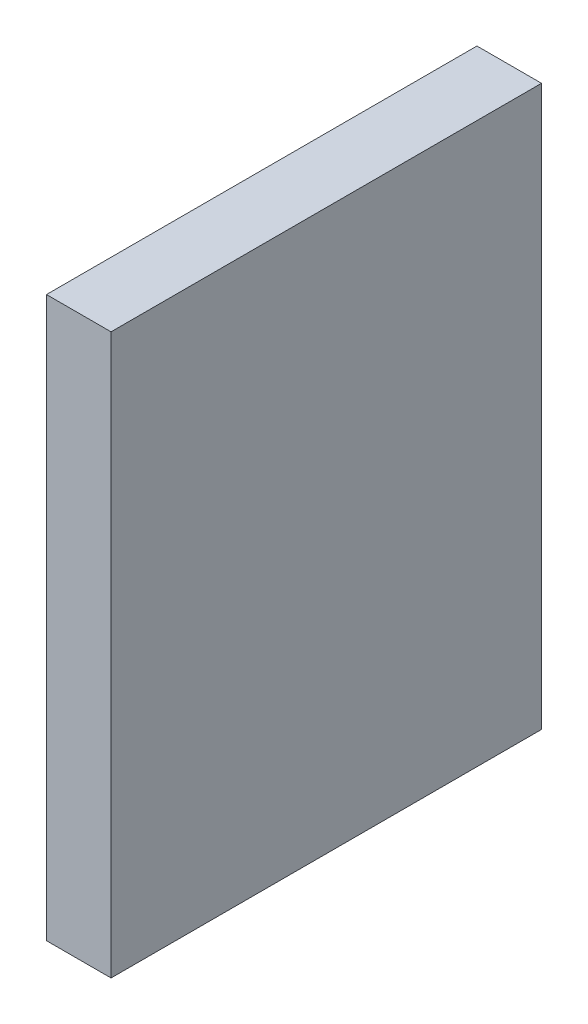
ISO-10303-21;
HEADER;
FILE_DESCRIPTION(('STEP AP214'),'2;1');
FILE_NAME('part.step','',(''),(''),'','','');
FILE_SCHEMA(('AUTOMOTIVE_DESIGN { 1 0 10303 214 1 1 1 1 }'));
ENDSEC;
DATA;
#1=APPLICATION_CONTEXT('core data for automotive mechanical design processes');
#2=APPLICATION_PROTOCOL_DEFINITION('international standard','automotive_design',2000,#1);
#3=PRODUCT_CONTEXT('',#1,'mechanical');
#4=PRODUCT('Part','Part','',(#3));
#5=PRODUCT_RELATED_PRODUCT_CATEGORY('part','',(#4));
#6=PRODUCT_DEFINITION_FORMATION('','',#4);
#7=PRODUCT_DEFINITION_CONTEXT('part definition',#1,'design');
#8=PRODUCT_DEFINITION('design','',#6,#7);
#9=PRODUCT_DEFINITION_SHAPE('','',#8);
#10=(LENGTH_UNIT() NAMED_UNIT(*) SI_UNIT(.MILLI.,.METRE.));
#11=(NAMED_UNIT(*) PLANE_ANGLE_UNIT() SI_UNIT($,.RADIAN.));
#12=(NAMED_UNIT(*) SI_UNIT($,.STERADIAN.) SOLID_ANGLE_UNIT());
#13=UNCERTAINTY_MEASURE_WITH_UNIT(LENGTH_MEASURE(1.E-05),#10,'distance_accuracy_value','');
#14=(GEOMETRIC_REPRESENTATION_CONTEXT(3) GLOBAL_UNCERTAINTY_ASSIGNED_CONTEXT((#13)) GLOBAL_UNIT_ASSIGNED_CONTEXT((#10,
#11,#12)) REPRESENTATION_CONTEXT('',''));
#15=CARTESIAN_POINT('',(0.,0.,0.));
#16=DIRECTION('',(0.,0.,1.));
#17=DIRECTION('',(1.,0.,0.));
#18=AXIS2_PLACEMENT_3D('',#15,#16,#17);
#19=CARTESIAN_POINT('',(-54.4573355862781,130.,-87.1653156513389));
#20=DIRECTION('',(1.,0.,0.));
#21=DIRECTION('',(0.,0.,-1.));
#22=AXIS2_PLACEMENT_3D('',#19,#20,#21);
#23=PLANE('',#22);
#24=DIRECTION('',(0.,0.,1.));
#25=VECTOR('',#24,1.);
#26=CARTESIAN_POINT('',(-54.4573355862781,0.,-87.1653156513389));
#27=LINE('',#26,#25);
#28=CARTESIAN_POINT('',(-54.4573355862781,0.,-87.1653156513389));
#29=VERTEX_POINT('',#28);
#30=CARTESIAN_POINT('',(-54.4573355862781,0.,12.8346843486611));
#31=VERTEX_POINT('',#30);
#32=EDGE_CURVE('E96',#29,#31,#27,.T.);
#33=ORIENTED_EDGE('',*,*,#32,.T.);
#34=DIRECTION('',(0.,-1.,0.));
#35=VECTOR('',#34,1.);
#36=CARTESIAN_POINT('',(-54.4573355862781,130.,12.8346843486611));
#37=LINE('',#36,#35);
#38=CARTESIAN_POINT('',(-54.4573355862781,130.,12.8346843486611));
#39=VERTEX_POINT('',#38);
#40=EDGE_CURVE('E11',#39,#31,#37,.T.);
#41=ORIENTED_EDGE('',*,*,#40,.F.);
#42=DIRECTION('',(0.,0.,1.));
#43=VECTOR('',#42,1.);
#44=CARTESIAN_POINT('',(-54.4573355862781,130.,-87.1653156513389));
#45=LINE('',#44,#43);
#46=CARTESIAN_POINT('',(-54.4573355862781,130.,-87.1653156513389));
#47=VERTEX_POINT('',#46);
#48=EDGE_CURVE('E84',#47,#39,#45,.T.);
#49=ORIENTED_EDGE('',*,*,#48,.F.);
#50=DIRECTION('',(0.,-1.,0.));
#51=VECTOR('',#50,1.);
#52=CARTESIAN_POINT('',(-54.4573355862781,130.,-87.1653156513389));
#53=LINE('',#52,#51);
#54=EDGE_CURVE('E92',#47,#29,#53,.T.);
#55=ORIENTED_EDGE('',*,*,#54,.T.);
#56=EDGE_LOOP('',(#33,#41,#49,#55));
#57=FACE_BOUND('',#56,.T.);
#58=ADVANCED_FACE('F33',(#57),#23,.F.);
#59=CARTESIAN_POINT('',(-54.4573355862781,130.,12.8346843486611));
#60=DIRECTION('',(0.,0.,-1.));
#61=DIRECTION('',(-1.,0.,0.));
#62=AXIS2_PLACEMENT_3D('',#59,#60,#61);
#63=PLANE('',#62);
#64=DIRECTION('',(1.,0.,0.));
#65=VECTOR('',#64,1.);
#66=CARTESIAN_POINT('',(-54.4573355862781,0.,12.8346843486611));
#67=LINE('',#66,#65);
#68=CARTESIAN_POINT('',(-39.4573355862781,0.,12.8346843486611));
#69=VERTEX_POINT('',#68);
#70=EDGE_CURVE('E88',#31,#69,#67,.T.);
#71=ORIENTED_EDGE('',*,*,#70,.T.);
#72=DIRECTION('',(0.,-1.,0.));
#73=VECTOR('',#72,1.);
#74=CARTESIAN_POINT('',(-39.4573355862781,130.,12.8346843486611));
#75=LINE('',#74,#73);
#76=CARTESIAN_POINT('',(-39.4573355862781,130.,12.8346843486611));
#77=VERTEX_POINT('',#76);
#78=EDGE_CURVE('E41',#77,#69,#75,.T.);
#79=ORIENTED_EDGE('',*,*,#78,.F.);
#80=DIRECTION('',(1.,0.,0.));
#81=VECTOR('',#80,1.);
#82=CARTESIAN_POINT('',(-54.4573355862781,130.,12.8346843486611));
#83=LINE('',#82,#81);
#84=EDGE_CURVE('E79',#39,#77,#83,.T.);
#85=ORIENTED_EDGE('',*,*,#84,.F.);
#86=ORIENTED_EDGE('',*,*,#40,.T.);
#87=EDGE_LOOP('',(#71,#79,#85,#86));
#88=FACE_BOUND('',#87,.T.);
#89=ADVANCED_FACE('F87',(#88),#63,.F.);
#90=CARTESIAN_POINT('',(-39.4573355862781,130.,-87.1653156513389));
#91=DIRECTION('',(-1.,0.,0.));
#92=DIRECTION('',(0.,0.,1.));
#93=AXIS2_PLACEMENT_3D('',#90,#91,#92);
#94=PLANE('',#93);
#95=DIRECTION('',(0.,0.,-1.));
#96=VECTOR('',#95,1.);
#97=CARTESIAN_POINT('',(-39.4573355862781,0.,-87.1653156513389));
#98=LINE('',#97,#96);
#99=CARTESIAN_POINT('',(-39.4573355862781,0.,-87.1653156513389));
#100=VERTEX_POINT('',#99);
#101=EDGE_CURVE('E66',#69,#100,#98,.T.);
#102=ORIENTED_EDGE('',*,*,#101,.T.);
#103=DIRECTION('',(0.,-1.,0.));
#104=VECTOR('',#103,1.);
#105=CARTESIAN_POINT('',(-39.4573355862781,130.,-87.1653156513389));
#106=LINE('',#105,#104);
#107=CARTESIAN_POINT('',(-39.4573355862781,130.,-87.1653156513389));
#108=VERTEX_POINT('',#107);
#109=EDGE_CURVE('E89',#108,#100,#106,.T.);
#110=ORIENTED_EDGE('',*,*,#109,.F.);
#111=DIRECTION('',(0.,0.,-1.));
#112=VECTOR('',#111,1.);
#113=CARTESIAN_POINT('',(-39.4573355862781,130.,-87.1653156513389));
#114=LINE('',#113,#112);
#115=EDGE_CURVE('E82',#77,#108,#114,.T.);
#116=ORIENTED_EDGE('',*,*,#115,.F.);
#117=ORIENTED_EDGE('',*,*,#78,.T.);
#118=EDGE_LOOP('',(#102,#110,#116,#117));
#119=FACE_BOUND('',#118,.T.);
#120=ADVANCED_FACE('F90',(#119),#94,.F.);
#121=CARTESIAN_POINT('',(-54.4573355862781,130.,-87.1653156513389));
#122=DIRECTION('',(0.,0.,1.));
#123=DIRECTION('',(1.,0.,0.));
#124=AXIS2_PLACEMENT_3D('',#121,#122,#123);
#125=PLANE('',#124);
#126=DIRECTION('',(-1.,0.,0.));
#127=VECTOR('',#126,1.);
#128=CARTESIAN_POINT('',(-54.4573355862781,0.,-87.1653156513389));
#129=LINE('',#128,#127);
#130=EDGE_CURVE('E72',#100,#29,#129,.T.);
#131=ORIENTED_EDGE('',*,*,#130,.T.);
#132=ORIENTED_EDGE('',*,*,#54,.F.);
#133=DIRECTION('',(-1.,0.,0.));
#134=VECTOR('',#133,1.);
#135=CARTESIAN_POINT('',(-54.4573355862781,130.,-87.1653156513389));
#136=LINE('',#135,#134);
#137=EDGE_CURVE('E49',#108,#47,#136,.T.);
#138=ORIENTED_EDGE('',*,*,#137,.F.);
#139=ORIENTED_EDGE('',*,*,#109,.T.);
#140=EDGE_LOOP('',(#131,#132,#138,#139));
#141=FACE_BOUND('',#140,.T.);
#142=ADVANCED_FACE('F103',(#141),#125,.F.);
#143=CARTESIAN_POINT('',(0.,130.,0.));
#144=DIRECTION('',(0.,1.,0.));
#145=DIRECTION('',(0.,0.,1.));
#146=AXIS2_PLACEMENT_3D('',#143,#144,#145);
#147=PLANE('',#146);
#148=ORIENTED_EDGE('',*,*,#48,.T.);
#149=ORIENTED_EDGE('',*,*,#84,.T.);
#150=ORIENTED_EDGE('',*,*,#115,.T.);
#151=ORIENTED_EDGE('',*,*,#137,.T.);
#152=EDGE_LOOP('',(#148,#149,#150,#151));
#153=FACE_BOUND('',#152,.T.);
#154=ADVANCED_FACE('F80',(#153),#147,.T.);
#155=CARTESIAN_POINT('',(0.,0.,0.));
#156=DIRECTION('',(0.,1.,0.));
#157=DIRECTION('',(0.,0.,1.));
#158=AXIS2_PLACEMENT_3D('',#155,#156,#157);
#159=PLANE('',#158);
#160=ORIENTED_EDGE('',*,*,#32,.F.);
#161=ORIENTED_EDGE('',*,*,#130,.F.);
#162=ORIENTED_EDGE('',*,*,#101,.F.);
#163=ORIENTED_EDGE('',*,*,#70,.F.);
#164=EDGE_LOOP('',(#160,#161,#162,#163));
#165=FACE_BOUND('',#164,.T.);
#166=ADVANCED_FACE('F106',(#165),#159,.F.);
#167=CLOSED_SHELL('',(#58,#89,#120,#142,#154,#166));
#168=MANIFOLD_SOLID_BREP('B2',#167);
#169=ADVANCED_BREP_SHAPE_REPRESENTATION('',(#18,#168),#14);
#170=SHAPE_DEFINITION_REPRESENTATION(#9,#169);
ENDSEC;
END-ISO-10303-21;
